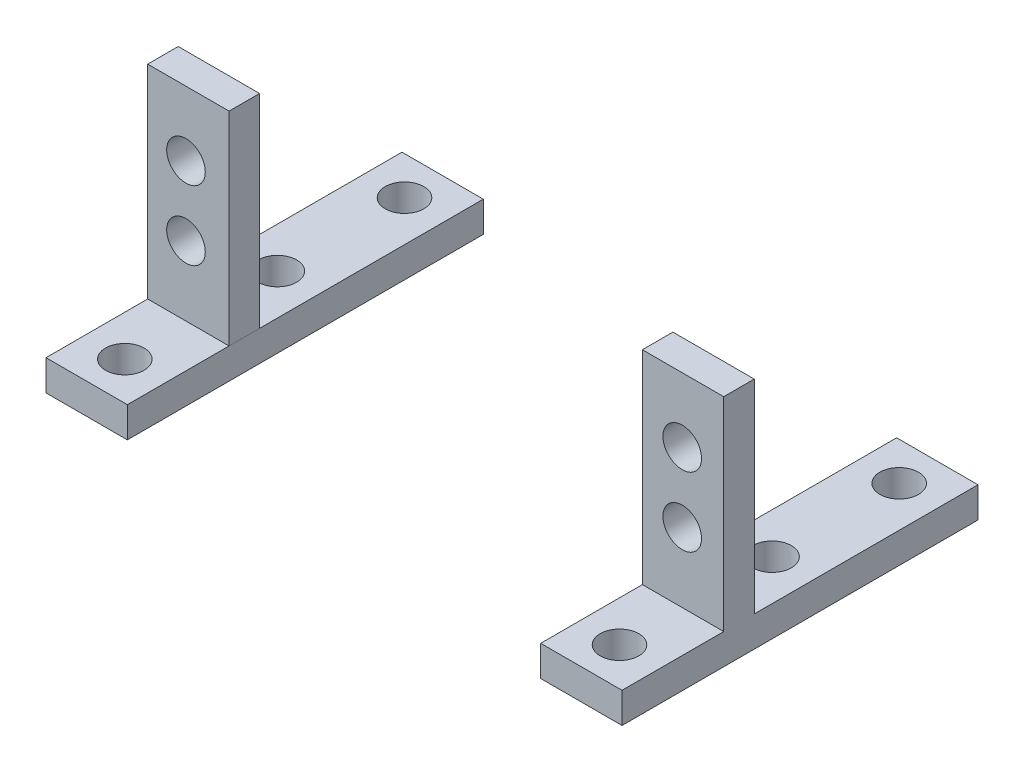
ISO-10303-21;
HEADER;
FILE_DESCRIPTION(('STEP AP214'),'2;1');
FILE_NAME('part.step','',(''),(''),'','','');
FILE_SCHEMA(('AUTOMOTIVE_DESIGN { 1 0 10303 214 1 1 1 1 }'));
ENDSEC;
DATA;
#1=APPLICATION_CONTEXT('core data for automotive mechanical design processes');
#2=APPLICATION_PROTOCOL_DEFINITION('international standard','automotive_design',2000,#1);
#3=PRODUCT_CONTEXT('',#1,'mechanical');
#4=PRODUCT('Part','Part','',(#3));
#5=PRODUCT_RELATED_PRODUCT_CATEGORY('part','',(#4));
#6=PRODUCT_DEFINITION_FORMATION('','',#4);
#7=PRODUCT_DEFINITION_CONTEXT('part definition',#1,'design');
#8=PRODUCT_DEFINITION('design','',#6,#7);
#9=PRODUCT_DEFINITION_SHAPE('','',#8);
#10=(LENGTH_UNIT() NAMED_UNIT(*) SI_UNIT(.MILLI.,.METRE.));
#11=(NAMED_UNIT(*) PLANE_ANGLE_UNIT() SI_UNIT($,.RADIAN.));
#12=(NAMED_UNIT(*) SI_UNIT($,.STERADIAN.) SOLID_ANGLE_UNIT());
#13=UNCERTAINTY_MEASURE_WITH_UNIT(LENGTH_MEASURE(1.E-05),#10,'distance_accuracy_value','');
#14=(GEOMETRIC_REPRESENTATION_CONTEXT(3) GLOBAL_UNCERTAINTY_ASSIGNED_CONTEXT((#13)) GLOBAL_UNIT_ASSIGNED_CONTEXT((#10,
#11,#12)) REPRESENTATION_CONTEXT('',''));
#15=CARTESIAN_POINT('',(0.,0.,0.));
#16=DIRECTION('',(0.,0.,1.));
#17=DIRECTION('',(1.,0.,0.));
#18=AXIS2_PLACEMENT_3D('',#15,#16,#17);
#19=CARTESIAN_POINT('',(-48.64,23.,-10.));
#20=DIRECTION('',(0.,0.,-1.));
#21=DIRECTION('',(-1.,0.,0.));
#22=AXIS2_PLACEMENT_3D('',#19,#20,#21);
#23=PLANE('',#22);
#24=CARTESIAN_POINT('',(-44.8768221418168,9.83031248341872,-10.));
#25=DIRECTION('',(0.,0.,1.));
#26=DIRECTION('',(1.,0.,0.));
#27=AXIS2_PLACEMENT_3D('',#24,#25,#26);
#28=CIRCLE('',#27,1.89865);
#29=CARTESIAN_POINT('',(-42.9781721418168,9.83031248341872,-10.));
#30=VERTEX_POINT('',#29);
#31=EDGE_CURVE('E125',#30,#30,#28,.T.);
#32=ORIENTED_EDGE('',*,*,#31,.F.);
#33=EDGE_LOOP('',(#32));
#34=FACE_BOUND('',#33,.T.);
#35=DIRECTION('',(1.,0.,0.));
#36=VECTOR('',#35,1.);
#37=CARTESIAN_POINT('',(-48.64,3.,-10.));
#38=LINE('',#37,#36);
#39=CARTESIAN_POINT('',(-48.64,3.,-10.));
#40=VERTEX_POINT('',#39);
#41=CARTESIAN_POINT('',(-40.64,3.,-10.));
#42=VERTEX_POINT('',#41);
#43=EDGE_CURVE('E100',#40,#42,#38,.T.);
#44=ORIENTED_EDGE('',*,*,#43,.T.);
#45=DIRECTION('',(0.,-1.,0.));
#46=VECTOR('',#45,1.);
#47=CARTESIAN_POINT('',(-40.64,23.,-10.));
#48=LINE('',#47,#46);
#49=CARTESIAN_POINT('',(-40.64,23.,-10.));
#50=VERTEX_POINT('',#49);
#51=EDGE_CURVE('E53',#50,#42,#48,.T.);
#52=ORIENTED_EDGE('',*,*,#51,.F.);
#53=DIRECTION('',(1.,0.,0.));
#54=VECTOR('',#53,1.);
#55=CARTESIAN_POINT('',(-48.64,23.,-10.));
#56=LINE('',#55,#54);
#57=CARTESIAN_POINT('',(-48.64,23.,-10.));
#58=VERTEX_POINT('',#57);
#59=EDGE_CURVE('E91',#58,#50,#56,.T.);
#60=ORIENTED_EDGE('',*,*,#59,.F.);
#61=DIRECTION('',(0.,-1.,0.));
#62=VECTOR('',#61,1.);
#63=CARTESIAN_POINT('',(-48.64,23.,-10.));
#64=LINE('',#63,#62);
#65=EDGE_CURVE('E12',#58,#40,#64,.T.);
#66=ORIENTED_EDGE('',*,*,#65,.T.);
#67=EDGE_LOOP('',(#44,#52,#60,#66));
#68=FACE_BOUND('',#67,.T.);
#69=CARTESIAN_POINT('',(-44.8768221418168,16.6415737305417,-10.));
#70=DIRECTION('',(0.,0.,1.));
#71=DIRECTION('',(1.,0.,0.));
#72=AXIS2_PLACEMENT_3D('',#69,#70,#71);
#73=CIRCLE('',#72,1.89865);
#74=CARTESIAN_POINT('',(-42.9781721418168,16.6415737305417,-10.));
#75=VERTEX_POINT('',#74);
#76=EDGE_CURVE('E128',#75,#75,#73,.T.);
#77=ORIENTED_EDGE('',*,*,#76,.F.);
#78=EDGE_LOOP('',(#77));
#79=FACE_BOUND('',#78,.T.);
#80=ADVANCED_FACE('F43',(#34,#68,#79),#23,.F.);
#81=CARTESIAN_POINT('',(-48.64,23.,-13.));
#82=DIRECTION('',(1.,0.,0.));
#83=DIRECTION('',(0.,0.,-1.));
#84=AXIS2_PLACEMENT_3D('',#81,#82,#83);
#85=PLANE('',#84);
#86=DIRECTION('',(0.,0.,1.));
#87=VECTOR('',#86,1.);
#88=CARTESIAN_POINT('',(-48.64,3.,-13.));
#89=LINE('',#88,#87);
#90=CARTESIAN_POINT('',(-48.64,3.,-13.));
#91=VERTEX_POINT('',#90);
#92=EDGE_CURVE('E109',#91,#40,#89,.T.);
#93=ORIENTED_EDGE('',*,*,#92,.T.);
#94=ORIENTED_EDGE('',*,*,#65,.F.);
#95=DIRECTION('',(0.,0.,1.));
#96=VECTOR('',#95,1.);
#97=CARTESIAN_POINT('',(-48.64,23.,-13.));
#98=LINE('',#97,#96);
#99=CARTESIAN_POINT('',(-48.64,23.,-13.));
#100=VERTEX_POINT('',#99);
#101=EDGE_CURVE('E96',#100,#58,#98,.T.);
#102=ORIENTED_EDGE('',*,*,#101,.F.);
#103=DIRECTION('',(0.,-1.,0.));
#104=VECTOR('',#103,1.);
#105=CARTESIAN_POINT('',(-48.64,23.,-13.));
#106=LINE('',#105,#104);
#107=EDGE_CURVE('E105',#100,#91,#106,.T.);
#108=ORIENTED_EDGE('',*,*,#107,.T.);
#109=EDGE_LOOP('',(#93,#94,#102,#108));
#110=FACE_BOUND('',#109,.T.);
#111=ADVANCED_FACE('F45',(#110),#85,.F.);
#112=CARTESIAN_POINT('',(-40.64,23.,-13.));
#113=DIRECTION('',(-1.,0.,0.));
#114=DIRECTION('',(0.,0.,1.));
#115=AXIS2_PLACEMENT_3D('',#112,#113,#114);
#116=PLANE('',#115);
#117=DIRECTION('',(0.,0.,-1.));
#118=VECTOR('',#117,1.);
#119=CARTESIAN_POINT('',(-40.64,3.,-13.));
#120=LINE('',#119,#118);
#121=CARTESIAN_POINT('',(-40.64,3.,-13.));
#122=VERTEX_POINT('',#121);
#123=EDGE_CURVE('E78',#42,#122,#120,.T.);
#124=ORIENTED_EDGE('',*,*,#123,.T.);
#125=DIRECTION('',(0.,-1.,0.));
#126=VECTOR('',#125,1.);
#127=CARTESIAN_POINT('',(-40.64,23.,-13.));
#128=LINE('',#127,#126);
#129=CARTESIAN_POINT('',(-40.64,23.,-13.));
#130=VERTEX_POINT('',#129);
#131=EDGE_CURVE('E101',#130,#122,#128,.T.);
#132=ORIENTED_EDGE('',*,*,#131,.F.);
#133=DIRECTION('',(0.,0.,-1.));
#134=VECTOR('',#133,1.);
#135=CARTESIAN_POINT('',(-40.64,23.,-13.));
#136=LINE('',#135,#134);
#137=EDGE_CURVE('E94',#50,#130,#136,.T.);
#138=ORIENTED_EDGE('',*,*,#137,.F.);
#139=ORIENTED_EDGE('',*,*,#51,.T.);
#140=EDGE_LOOP('',(#124,#132,#138,#139));
#141=FACE_BOUND('',#140,.T.);
#142=ADVANCED_FACE('F103',(#141),#116,.F.);
#143=CARTESIAN_POINT('',(-48.64,23.,-13.));
#144=DIRECTION('',(0.,0.,1.));
#145=DIRECTION('',(1.,0.,0.));
#146=AXIS2_PLACEMENT_3D('',#143,#144,#145);
#147=PLANE('',#146);
#148=CARTESIAN_POINT('',(-44.8768221418168,16.6415737305417,-13.));
#149=DIRECTION('',(0.,0.,1.));
#150=DIRECTION('',(1.,0.,0.));
#151=AXIS2_PLACEMENT_3D('',#148,#149,#150);
#152=CIRCLE('',#151,1.89865);
#153=CARTESIAN_POINT('',(-42.9781721418168,16.6415737305417,-13.));
#154=VERTEX_POINT('',#153);
#155=EDGE_CURVE('E47',#154,#154,#152,.T.);
#156=ORIENTED_EDGE('',*,*,#155,.T.);
#157=EDGE_LOOP('',(#156));
#158=FACE_BOUND('',#157,.T.);
#159=CARTESIAN_POINT('',(-44.8768221418168,9.83031248341872,-13.));
#160=DIRECTION('',(0.,0.,1.));
#161=DIRECTION('',(1.,0.,0.));
#162=AXIS2_PLACEMENT_3D('',#159,#160,#161);
#163=CIRCLE('',#162,1.89865);
#164=CARTESIAN_POINT('',(-42.9781721418168,9.83031248341872,-13.));
#165=VERTEX_POINT('',#164);
#166=EDGE_CURVE('E112',#165,#165,#163,.T.);
#167=ORIENTED_EDGE('',*,*,#166,.T.);
#168=EDGE_LOOP('',(#167));
#169=FACE_BOUND('',#168,.T.);
#170=DIRECTION('',(-1.,0.,0.));
#171=VECTOR('',#170,1.);
#172=CARTESIAN_POINT('',(-48.64,3.,-13.));
#173=LINE('',#172,#171);
#174=EDGE_CURVE('E84',#122,#91,#173,.T.);
#175=ORIENTED_EDGE('',*,*,#174,.T.);
#176=ORIENTED_EDGE('',*,*,#107,.F.);
#177=DIRECTION('',(-1.,0.,0.));
#178=VECTOR('',#177,1.);
#179=CARTESIAN_POINT('',(-48.64,23.,-13.));
#180=LINE('',#179,#178);
#181=EDGE_CURVE('E61',#130,#100,#180,.T.);
#182=ORIENTED_EDGE('',*,*,#181,.F.);
#183=ORIENTED_EDGE('',*,*,#131,.T.);
#184=EDGE_LOOP('',(#175,#176,#182,#183));
#185=FACE_BOUND('',#184,.T.);
#186=ADVANCED_FACE('F117',(#158,#169,#185),#147,.F.);
#187=CARTESIAN_POINT('',(0.,23.,0.));
#188=DIRECTION('',(0.,1.,0.));
#189=DIRECTION('',(0.,0.,1.));
#190=AXIS2_PLACEMENT_3D('',#187,#188,#189);
#191=PLANE('',#190);
#192=ORIENTED_EDGE('',*,*,#101,.T.);
#193=ORIENTED_EDGE('',*,*,#59,.T.);
#194=ORIENTED_EDGE('',*,*,#137,.T.);
#195=ORIENTED_EDGE('',*,*,#181,.T.);
#196=EDGE_LOOP('',(#192,#193,#194,#195));
#197=FACE_BOUND('',#196,.T.);
#198=ADVANCED_FACE('F92',(#197),#191,.T.);
#199=CARTESIAN_POINT('',(0.,3.,0.));
#200=DIRECTION('',(0.,1.,0.));
#201=DIRECTION('',(0.,0.,1.));
#202=AXIS2_PLACEMENT_3D('',#199,#200,#201);
#203=PLANE('',#202);
#204=ORIENTED_EDGE('',*,*,#92,.F.);
#205=ORIENTED_EDGE('',*,*,#174,.F.);
#206=ORIENTED_EDGE('',*,*,#123,.F.);
#207=ORIENTED_EDGE('',*,*,#43,.F.);
#208=EDGE_LOOP('',(#204,#205,#206,#207));
#209=FACE_BOUND('',#208,.T.);
#210=ADVANCED_FACE('F120',(#209),#203,.F.);
#211=CARTESIAN_POINT('',(-44.8768221418168,9.83031248341872,-10.));
#212=DIRECTION('',(0.,0.,1.));
#213=DIRECTION('',(1.,0.,0.));
#214=AXIS2_PLACEMENT_3D('',#211,#212,#213);
#215=CYLINDRICAL_SURFACE('',#214,1.89865);
#216=ORIENTED_EDGE('',*,*,#31,.T.);
#217=EDGE_LOOP('',(#216));
#218=FACE_BOUND('',#217,.T.);
#219=ORIENTED_EDGE('',*,*,#166,.F.);
#220=EDGE_LOOP('',(#219));
#221=FACE_BOUND('',#220,.T.);
#222=ADVANCED_FACE('F139',(#218,#221),#215,.F.);
#223=CARTESIAN_POINT('',(-44.8768221418168,16.6415737305417,-10.));
#224=DIRECTION('',(0.,0.,1.));
#225=DIRECTION('',(1.,0.,0.));
#226=AXIS2_PLACEMENT_3D('',#223,#224,#225);
#227=CYLINDRICAL_SURFACE('',#226,1.89865);
#228=ORIENTED_EDGE('',*,*,#76,.T.);
#229=EDGE_LOOP('',(#228));
#230=FACE_BOUND('',#229,.T.);
#231=ORIENTED_EDGE('',*,*,#155,.F.);
#232=EDGE_LOOP('',(#231));
#233=FACE_BOUND('',#232,.T.);
#234=ADVANCED_FACE('F137',(#230,#233),#227,.F.);
#235=CLOSED_SHELL('',(#80,#111,#142,#186,#198,#210,#222,#234));
#236=MANIFOLD_SOLID_BREP('B2',#235);
#237=CARTESIAN_POINT('',(-48.64,3.,-35.));
#238=DIRECTION('',(1.,0.,0.));
#239=DIRECTION('',(0.,0.,-1.));
#240=AXIS2_PLACEMENT_3D('',#237,#238,#239);
#241=PLANE('',#240);
#242=DIRECTION('',(0.,0.,1.));
#243=VECTOR('',#242,1.);
#244=CARTESIAN_POINT('',(-48.64,0.,-35.));
#245=LINE('',#244,#243);
#246=CARTESIAN_POINT('',(-48.64,0.,-35.));
#247=VERTEX_POINT('',#246);
#248=CARTESIAN_POINT('',(-48.64,0.,0.));
#249=VERTEX_POINT('',#248);
#250=EDGE_CURVE('E281',#247,#249,#245,.T.);
#251=ORIENTED_EDGE('',*,*,#250,.T.);
#252=DIRECTION('',(0.,-1.,0.));
#253=VECTOR('',#252,1.);
#254=CARTESIAN_POINT('',(-48.64,3.,0.));
#255=LINE('',#254,#253);
#256=CARTESIAN_POINT('',(-48.64,3.,0.));
#257=VERTEX_POINT('',#256);
#258=EDGE_CURVE('E41',#257,#249,#255,.T.);
#259=ORIENTED_EDGE('',*,*,#258,.F.);
#260=DIRECTION('',(0.,0.,1.));
#261=VECTOR('',#260,1.);
#262=CARTESIAN_POINT('',(-48.64,3.,-35.));
#263=LINE('',#262,#261);
#264=CARTESIAN_POINT('',(-48.64,3.,-35.));
#265=VERTEX_POINT('',#264);
#266=EDGE_CURVE('E269',#265,#257,#263,.T.);
#267=ORIENTED_EDGE('',*,*,#266,.F.);
#268=DIRECTION('',(0.,-1.,0.));
#269=VECTOR('',#268,1.);
#270=CARTESIAN_POINT('',(-48.64,3.,-35.));
#271=LINE('',#270,#269);
#272=EDGE_CURVE('E277',#265,#247,#271,.T.);
#273=ORIENTED_EDGE('',*,*,#272,.T.);
#274=EDGE_LOOP('',(#251,#259,#267,#273));
#275=FACE_BOUND('',#274,.T.);
#276=ADVANCED_FACE('F218',(#275),#241,.F.);
#277=CARTESIAN_POINT('',(-48.64,3.,0.));
#278=DIRECTION('',(0.,0.,-1.));
#279=DIRECTION('',(-1.,0.,0.));
#280=AXIS2_PLACEMENT_3D('',#277,#278,#279);
#281=PLANE('',#280);
#282=DIRECTION('',(1.,0.,0.));
#283=VECTOR('',#282,1.);
#284=CARTESIAN_POINT('',(-48.64,0.,0.));
#285=LINE('',#284,#283);
#286=CARTESIAN_POINT('',(-40.64,0.,0.));
#287=VERTEX_POINT('',#286);
#288=EDGE_CURVE('E273',#249,#287,#285,.T.);
#289=ORIENTED_EDGE('',*,*,#288,.T.);
#290=DIRECTION('',(0.,-1.,0.));
#291=VECTOR('',#290,1.);
#292=CARTESIAN_POINT('',(-40.64,3.,0.));
#293=LINE('',#292,#291);
#294=CARTESIAN_POINT('',(-40.64,3.,0.));
#295=VERTEX_POINT('',#294);
#296=EDGE_CURVE('E226',#295,#287,#293,.T.);
#297=ORIENTED_EDGE('',*,*,#296,.F.);
#298=DIRECTION('',(1.,0.,0.));
#299=VECTOR('',#298,1.);
#300=CARTESIAN_POINT('',(-48.64,3.,0.));
#301=LINE('',#300,#299);
#302=EDGE_CURVE('E264',#257,#295,#301,.T.);
#303=ORIENTED_EDGE('',*,*,#302,.F.);
#304=ORIENTED_EDGE('',*,*,#258,.T.);
#305=EDGE_LOOP('',(#289,#297,#303,#304));
#306=FACE_BOUND('',#305,.T.);
#307=ADVANCED_FACE('F272',(#306),#281,.F.);
#308=CARTESIAN_POINT('',(-40.64,3.,-35.));
#309=DIRECTION('',(-1.,0.,0.));
#310=DIRECTION('',(0.,0.,1.));
#311=AXIS2_PLACEMENT_3D('',#308,#309,#310);
#312=PLANE('',#311);
#313=DIRECTION('',(0.,0.,-1.));
#314=VECTOR('',#313,1.);
#315=CARTESIAN_POINT('',(-40.64,0.,-35.));
#316=LINE('',#315,#314);
#317=CARTESIAN_POINT('',(-40.64,0.,-35.));
#318=VERTEX_POINT('',#317);
#319=EDGE_CURVE('E251',#287,#318,#316,.T.);
#320=ORIENTED_EDGE('',*,*,#319,.T.);
#321=DIRECTION('',(0.,-1.,0.));
#322=VECTOR('',#321,1.);
#323=CARTESIAN_POINT('',(-40.64,3.,-35.));
#324=LINE('',#323,#322);
#325=CARTESIAN_POINT('',(-40.64,3.,-35.));
#326=VERTEX_POINT('',#325);
#327=EDGE_CURVE('E274',#326,#318,#324,.T.);
#328=ORIENTED_EDGE('',*,*,#327,.F.);
#329=DIRECTION('',(0.,0.,-1.));
#330=VECTOR('',#329,1.);
#331=CARTESIAN_POINT('',(-40.64,3.,-35.));
#332=LINE('',#331,#330);
#333=EDGE_CURVE('E267',#295,#326,#332,.T.);
#334=ORIENTED_EDGE('',*,*,#333,.F.);
#335=ORIENTED_EDGE('',*,*,#296,.T.);
#336=EDGE_LOOP('',(#320,#328,#334,#335));
#337=FACE_BOUND('',#336,.T.);
#338=ADVANCED_FACE('F275',(#337),#312,.F.);
#339=CARTESIAN_POINT('',(-48.64,3.,-35.));
#340=DIRECTION('',(0.,0.,1.));
#341=DIRECTION('',(1.,0.,0.));
#342=AXIS2_PLACEMENT_3D('',#339,#340,#341);
#343=PLANE('',#342);
#344=DIRECTION('',(-1.,0.,0.));
#345=VECTOR('',#344,1.);
#346=CARTESIAN_POINT('',(-48.64,0.,-35.));
#347=LINE('',#346,#345);
#348=EDGE_CURVE('E257',#318,#247,#347,.T.);
#349=ORIENTED_EDGE('',*,*,#348,.T.);
#350=ORIENTED_EDGE('',*,*,#272,.F.);
#351=DIRECTION('',(-1.,0.,0.));
#352=VECTOR('',#351,1.);
#353=CARTESIAN_POINT('',(-48.64,3.,-35.));
#354=LINE('',#353,#352);
#355=EDGE_CURVE('E234',#326,#265,#354,.T.);
#356=ORIENTED_EDGE('',*,*,#355,.F.);
#357=ORIENTED_EDGE('',*,*,#327,.T.);
#358=EDGE_LOOP('',(#349,#350,#356,#357));
#359=FACE_BOUND('',#358,.T.);
#360=ADVANCED_FACE('F289',(#359),#343,.F.);
#361=CARTESIAN_POINT('',(0.,3.,0.));
#362=DIRECTION('',(0.,1.,0.));
#363=DIRECTION('',(0.,0.,1.));
#364=AXIS2_PLACEMENT_3D('',#361,#362,#363);
#365=PLANE('',#364);
#366=CARTESIAN_POINT('',(-44.64,3.,-31.25));
#367=DIRECTION('',(0.,1.,0.));
#368=DIRECTION('',(0.,0.,1.));
#369=AXIS2_PLACEMENT_3D('',#366,#367,#368);
#370=CIRCLE('',#369,1.89864999999999);
#371=CARTESIAN_POINT('',(-44.64,3.,-29.35135));
#372=VERTEX_POINT('',#371);
#373=EDGE_CURVE('E309',#372,#372,#370,.T.);
#374=ORIENTED_EDGE('',*,*,#373,.F.);
#375=EDGE_LOOP('',(#374));
#376=FACE_BOUND('',#375,.T.);
#377=CARTESIAN_POINT('',(-44.64,3.,-18.75));
#378=DIRECTION('',(0.,1.,0.));
#379=DIRECTION('',(0.,0.,1.));
#380=AXIS2_PLACEMENT_3D('',#377,#378,#379);
#381=CIRCLE('',#380,1.89864999999999);
#382=CARTESIAN_POINT('',(-44.64,3.,-16.85135));
#383=VERTEX_POINT('',#382);
#384=EDGE_CURVE('E303',#383,#383,#381,.T.);
#385=ORIENTED_EDGE('',*,*,#384,.F.);
#386=EDGE_LOOP('',(#385));
#387=FACE_BOUND('',#386,.T.);
#388=CARTESIAN_POINT('',(-44.64,3.,-3.75));
#389=DIRECTION('',(0.,1.,0.));
#390=DIRECTION('',(0.,0.,1.));
#391=AXIS2_PLACEMENT_3D('',#388,#389,#390);
#392=CIRCLE('',#391,1.89864999999999);
#393=CARTESIAN_POINT('',(-44.64,3.,-1.85135000000001));
#394=VERTEX_POINT('',#393);
#395=EDGE_CURVE('E297',#394,#394,#392,.T.);
#396=ORIENTED_EDGE('',*,*,#395,.F.);
#397=EDGE_LOOP('',(#396));
#398=FACE_BOUND('',#397,.T.);
#399=ORIENTED_EDGE('',*,*,#266,.T.);
#400=ORIENTED_EDGE('',*,*,#302,.T.);
#401=ORIENTED_EDGE('',*,*,#333,.T.);
#402=ORIENTED_EDGE('',*,*,#355,.T.);
#403=EDGE_LOOP('',(#399,#400,#401,#402));
#404=FACE_BOUND('',#403,.T.);
#405=ADVANCED_FACE('F265',(#376,#387,#398,#404),#365,.T.);
#406=CARTESIAN_POINT('',(0.,0.,0.));
#407=DIRECTION('',(0.,1.,0.));
#408=DIRECTION('',(0.,0.,1.));
#409=AXIS2_PLACEMENT_3D('',#406,#407,#408);
#410=PLANE('',#409);
#411=CARTESIAN_POINT('',(-44.64,0.,-31.25));
#412=DIRECTION('',(0.,1.,0.));
#413=DIRECTION('',(0.,0.,1.));
#414=AXIS2_PLACEMENT_3D('',#411,#412,#413);
#415=CIRCLE('',#414,1.89865);
#416=CARTESIAN_POINT('',(-44.64,0.,-29.35135));
#417=VERTEX_POINT('',#416);
#418=EDGE_CURVE('E306',#417,#417,#415,.T.);
#419=ORIENTED_EDGE('',*,*,#418,.T.);
#420=EDGE_LOOP('',(#419));
#421=FACE_BOUND('',#420,.T.);
#422=CARTESIAN_POINT('',(-44.64,0.,-18.75));
#423=DIRECTION('',(0.,1.,0.));
#424=DIRECTION('',(0.,0.,1.));
#425=AXIS2_PLACEMENT_3D('',#422,#423,#424);
#426=CIRCLE('',#425,1.89865);
#427=CARTESIAN_POINT('',(-44.64,0.,-16.85135));
#428=VERTEX_POINT('',#427);
#429=EDGE_CURVE('E300',#428,#428,#426,.T.);
#430=ORIENTED_EDGE('',*,*,#429,.T.);
#431=EDGE_LOOP('',(#430));
#432=FACE_BOUND('',#431,.T.);
#433=CARTESIAN_POINT('',(-44.64,0.,-3.75));
#434=DIRECTION('',(0.,1.,0.));
#435=DIRECTION('',(0.,0.,1.));
#436=AXIS2_PLACEMENT_3D('',#433,#434,#435);
#437=CIRCLE('',#436,1.89865);
#438=CARTESIAN_POINT('',(-44.64,0.,-1.85135));
#439=VERTEX_POINT('',#438);
#440=EDGE_CURVE('E284',#439,#439,#437,.T.);
#441=ORIENTED_EDGE('',*,*,#440,.T.);
#442=EDGE_LOOP('',(#441));
#443=FACE_BOUND('',#442,.T.);
#444=ORIENTED_EDGE('',*,*,#250,.F.);
#445=ORIENTED_EDGE('',*,*,#348,.F.);
#446=ORIENTED_EDGE('',*,*,#319,.F.);
#447=ORIENTED_EDGE('',*,*,#288,.F.);
#448=EDGE_LOOP('',(#444,#445,#446,#447));
#449=FACE_BOUND('',#448,.T.);
#450=ADVANCED_FACE('F292',(#421,#432,#443,#449),#410,.F.);
#451=CARTESIAN_POINT('',(-44.64,3.,-3.75));
#452=DIRECTION('',(0.,1.,0.));
#453=DIRECTION('',(0.,0.,1.));
#454=AXIS2_PLACEMENT_3D('',#451,#452,#453);
#455=CYLINDRICAL_SURFACE('',#454,1.89864999999999);
#456=ORIENTED_EDGE('',*,*,#440,.F.);
#457=EDGE_LOOP('',(#456));
#458=FACE_BOUND('',#457,.T.);
#459=ORIENTED_EDGE('',*,*,#395,.T.);
#460=EDGE_LOOP('',(#459));
#461=FACE_BOUND('',#460,.T.);
#462=ADVANCED_FACE('F322',(#458,#461),#455,.F.);
#463=CARTESIAN_POINT('',(-44.64,3.,-18.75));
#464=DIRECTION('',(0.,1.,0.));
#465=DIRECTION('',(0.,0.,1.));
#466=AXIS2_PLACEMENT_3D('',#463,#464,#465);
#467=CYLINDRICAL_SURFACE('',#466,1.89864999999999);
#468=ORIENTED_EDGE('',*,*,#429,.F.);
#469=EDGE_LOOP('',(#468));
#470=FACE_BOUND('',#469,.T.);
#471=ORIENTED_EDGE('',*,*,#384,.T.);
#472=EDGE_LOOP('',(#471));
#473=FACE_BOUND('',#472,.T.);
#474=ADVANCED_FACE('F324',(#470,#473),#467,.F.);
#475=CARTESIAN_POINT('',(-44.64,3.,-31.25));
#476=DIRECTION('',(0.,1.,0.));
#477=DIRECTION('',(0.,0.,1.));
#478=AXIS2_PLACEMENT_3D('',#475,#476,#477);
#479=CYLINDRICAL_SURFACE('',#478,1.89864999999999);
#480=ORIENTED_EDGE('',*,*,#418,.F.);
#481=EDGE_LOOP('',(#480));
#482=FACE_BOUND('',#481,.T.);
#483=ORIENTED_EDGE('',*,*,#373,.T.);
#484=EDGE_LOOP('',(#483));
#485=FACE_BOUND('',#484,.T.);
#486=ADVANCED_FACE('F313',(#482,#485),#479,.F.);
#487=CLOSED_SHELL('',(#276,#307,#338,#360,#405,#450,#462,#474,#486));
#488=MANIFOLD_SOLID_BREP('B6',#487);
#489=CARTESIAN_POINT('',(0.,3.,0.));
#490=DIRECTION('',(0.,1.,0.));
#491=DIRECTION('',(0.,0.,1.));
#492=AXIS2_PLACEMENT_3D('',#489,#490,#491);
#493=PLANE('',#492);
#494=CARTESIAN_POINT('',(4.,3.,-31.25));
#495=DIRECTION('',(0.,1.,0.));
#496=DIRECTION('',(0.,0.,1.));
#497=AXIS2_PLACEMENT_3D('',#494,#495,#496);
#498=CIRCLE('',#497,1.89864999999999);
#499=CARTESIAN_POINT('',(4.,3.,-29.35135));
#500=VERTEX_POINT('',#499);
#501=EDGE_CURVE('E576',#500,#500,#498,.T.);
#502=ORIENTED_EDGE('',*,*,#501,.F.);
#503=EDGE_LOOP('',(#502));
#504=FACE_BOUND('',#503,.T.);
#505=CARTESIAN_POINT('',(4.,3.,-18.75));
#506=DIRECTION('',(0.,1.,0.));
#507=DIRECTION('',(0.,0.,1.));
#508=AXIS2_PLACEMENT_3D('',#505,#506,#507);
#509=CIRCLE('',#508,1.89864999999999);
#510=CARTESIAN_POINT('',(4.,3.,-16.85135));
#511=VERTEX_POINT('',#510);
#512=EDGE_CURVE('E570',#511,#511,#509,.T.);
#513=ORIENTED_EDGE('',*,*,#512,.F.);
#514=EDGE_LOOP('',(#513));
#515=FACE_BOUND('',#514,.T.);
#516=DIRECTION('',(-1.,0.,0.));
#517=VECTOR('',#516,1.);
#518=CARTESIAN_POINT('',(0.,3.,-13.));
#519=LINE('',#518,#517);
#520=CARTESIAN_POINT('',(7.99999999999999,3.,-13.));
#521=VERTEX_POINT('',#520);
#522=CARTESIAN_POINT('',(0.,3.,-13.));
#523=VERTEX_POINT('',#522);
#524=EDGE_CURVE('E420',#521,#523,#519,.T.);
#525=ORIENTED_EDGE('',*,*,#524,.F.);
#526=DIRECTION('',(0.,0.,-1.));
#527=VECTOR('',#526,1.);
#528=CARTESIAN_POINT('',(7.99999999999999,3.,-35.));
#529=LINE('',#528,#527);
#530=CARTESIAN_POINT('',(7.99999999999999,3.,-35.));
#531=VERTEX_POINT('',#530);
#532=EDGE_CURVE('E505',#521,#531,#529,.T.);
#533=ORIENTED_EDGE('',*,*,#532,.T.);
#534=DIRECTION('',(-1.,0.,0.));
#535=VECTOR('',#534,1.);
#536=CARTESIAN_POINT('',(0.,3.,-35.));
#537=LINE('',#536,#535);
#538=CARTESIAN_POINT('',(0.,3.,-35.));
#539=VERTEX_POINT('',#538);
#540=EDGE_CURVE('E508',#531,#539,#537,.T.);
#541=ORIENTED_EDGE('',*,*,#540,.T.);
#542=DIRECTION('',(0.,0.,1.));
#543=VECTOR('',#542,1.);
#544=CARTESIAN_POINT('',(0.,3.,-35.));
#545=LINE('',#544,#543);
#546=EDGE_CURVE('E501',#539,#523,#545,.T.);
#547=ORIENTED_EDGE('',*,*,#546,.T.);
#548=EDGE_LOOP('',(#525,#533,#541,#547));
#549=FACE_BOUND('',#548,.T.);
#550=ADVANCED_FACE('F405',(#504,#515,#549),#493,.T.);
#551=CARTESIAN_POINT('',(0.,3.,-35.));
#552=DIRECTION('',(1.,0.,0.));
#553=DIRECTION('',(0.,0.,-1.));
#554=AXIS2_PLACEMENT_3D('',#551,#552,#553);
#555=PLANE('',#554);
#556=DIRECTION('',(0.,0.,1.));
#557=VECTOR('',#556,1.);
#558=CARTESIAN_POINT('',(0.,0.,-35.));
#559=LINE('',#558,#557);
#560=CARTESIAN_POINT('',(0.,0.,-35.));
#561=VERTEX_POINT('',#560);
#562=CARTESIAN_POINT('',(0.,0.,0.));
#563=VERTEX_POINT('',#562);
#564=EDGE_CURVE('E493',#561,#563,#559,.T.);
#565=ORIENTED_EDGE('',*,*,#564,.T.);
#566=DIRECTION('',(0.,-1.,0.));
#567=VECTOR('',#566,1.);
#568=CARTESIAN_POINT('',(0.,3.,0.));
#569=LINE('',#568,#567);
#570=CARTESIAN_POINT('',(0.,3.,0.));
#571=VERTEX_POINT('',#570);
#572=EDGE_CURVE('E216',#571,#563,#569,.T.);
#573=ORIENTED_EDGE('',*,*,#572,.F.);
#574=CARTESIAN_POINT('',(0.,3.,-10.));
#575=VERTEX_POINT('',#574);
#576=EDGE_CURVE('E492',#575,#571,#545,.T.);
#577=ORIENTED_EDGE('',*,*,#576,.F.);
#578=DIRECTION('',(0.,-1.,0.));
#579=VECTOR('',#578,1.);
#580=CARTESIAN_POINT('',(0.,23.,-10.));
#581=LINE('',#580,#579);
#582=CARTESIAN_POINT('',(0.,23.,-10.));
#583=VERTEX_POINT('',#582);
#584=EDGE_CURVE('E474',#583,#575,#581,.T.);
#585=ORIENTED_EDGE('',*,*,#584,.F.);
#586=DIRECTION('',(0.,0.,1.));
#587=VECTOR('',#586,1.);
#588=CARTESIAN_POINT('',(0.,23.,-13.));
#589=LINE('',#588,#587);
#590=CARTESIAN_POINT('',(0.,23.,-13.));
#591=VERTEX_POINT('',#590);
#592=EDGE_CURVE('E480',#591,#583,#589,.T.);
#593=ORIENTED_EDGE('',*,*,#592,.F.);
#594=DIRECTION('',(0.,-1.,0.));
#595=VECTOR('',#594,1.);
#596=CARTESIAN_POINT('',(0.,23.,-13.));
#597=LINE('',#596,#595);
#598=EDGE_CURVE('E538',#591,#523,#597,.T.);
#599=ORIENTED_EDGE('',*,*,#598,.T.);
#600=ORIENTED_EDGE('',*,*,#546,.F.);
#601=DIRECTION('',(0.,-1.,0.));
#602=VECTOR('',#601,1.);
#603=CARTESIAN_POINT('',(0.,3.,-35.));
#604=LINE('',#603,#602);
#605=EDGE_CURVE('E509',#539,#561,#604,.T.);
#606=ORIENTED_EDGE('',*,*,#605,.T.);
#607=EDGE_LOOP('',(#565,#573,#577,#585,#593,#599,#600,#606));
#608=FACE_BOUND('',#607,.T.);
#609=ADVANCED_FACE('F407',(#608),#555,.F.);
#610=CARTESIAN_POINT('',(0.,3.,0.));
#611=DIRECTION('',(0.,0.,-1.));
#612=DIRECTION('',(-1.,0.,0.));
#613=AXIS2_PLACEMENT_3D('',#610,#611,#612);
#614=PLANE('',#613);
#615=DIRECTION('',(1.,0.,0.));
#616=VECTOR('',#615,1.);
#617=CARTESIAN_POINT('',(0.,0.,0.));
#618=LINE('',#617,#616);
#619=CARTESIAN_POINT('',(8.,0.,0.));
#620=VERTEX_POINT('',#619);
#621=EDGE_CURVE('E495',#563,#620,#618,.T.);
#622=ORIENTED_EDGE('',*,*,#621,.T.);
#623=DIRECTION('',(0.,-1.,0.));
#624=VECTOR('',#623,1.);
#625=CARTESIAN_POINT('',(8.,3.,0.));
#626=LINE('',#625,#624);
#627=CARTESIAN_POINT('',(8.,3.,0.));
#628=VERTEX_POINT('',#627);
#629=EDGE_CURVE('E413',#628,#620,#626,.T.);
#630=ORIENTED_EDGE('',*,*,#629,.F.);
#631=DIRECTION('',(1.,0.,0.));
#632=VECTOR('',#631,1.);
#633=CARTESIAN_POINT('',(0.,3.,0.));
#634=LINE('',#633,#632);
#635=EDGE_CURVE('E503',#571,#628,#634,.T.);
#636=ORIENTED_EDGE('',*,*,#635,.F.);
#637=ORIENTED_EDGE('',*,*,#572,.T.);
#638=EDGE_LOOP('',(#622,#630,#636,#637));
#639=FACE_BOUND('',#638,.T.);
#640=ADVANCED_FACE('F627',(#639),#614,.F.);
#641=CARTESIAN_POINT('',(7.99999999999999,3.,-35.));
#642=DIRECTION('',(-1.,0.,0.));
#643=DIRECTION('',(0.,0.,1.));
#644=AXIS2_PLACEMENT_3D('',#641,#642,#643);
#645=PLANE('',#644);
#646=DIRECTION('',(0.,0.,-1.));
#647=VECTOR('',#646,1.);
#648=CARTESIAN_POINT('',(7.99999999999999,0.,-35.));
#649=LINE('',#648,#647);
#650=CARTESIAN_POINT('',(7.99999999999999,0.,-35.));
#651=VERTEX_POINT('',#650);
#652=EDGE_CURVE('E512',#620,#651,#649,.T.);
#653=ORIENTED_EDGE('',*,*,#652,.T.);
#654=DIRECTION('',(0.,-1.,0.));
#655=VECTOR('',#654,1.);
#656=CARTESIAN_POINT('',(7.99999999999999,3.,-35.));
#657=LINE('',#656,#655);
#658=EDGE_CURVE('E518',#531,#651,#657,.T.);
#659=ORIENTED_EDGE('',*,*,#658,.F.);
#660=ORIENTED_EDGE('',*,*,#532,.F.);
#661=DIRECTION('',(0.,-1.,0.));
#662=VECTOR('',#661,1.);
#663=CARTESIAN_POINT('',(8.,23.,-13.));
#664=LINE('',#663,#662);
#665=CARTESIAN_POINT('',(8.,23.,-13.));
#666=VERTEX_POINT('',#665);
#667=EDGE_CURVE('E497',#666,#521,#664,.T.);
#668=ORIENTED_EDGE('',*,*,#667,.F.);
#669=DIRECTION('',(0.,0.,-1.));
#670=VECTOR('',#669,1.);
#671=CARTESIAN_POINT('',(8.,23.,-13.));
#672=LINE('',#671,#670);
#673=CARTESIAN_POINT('',(8.,23.,-10.));
#674=VERTEX_POINT('',#673);
#675=EDGE_CURVE('E479',#674,#666,#672,.T.);
#676=ORIENTED_EDGE('',*,*,#675,.F.);
#677=DIRECTION('',(0.,-1.,0.));
#678=VECTOR('',#677,1.);
#679=CARTESIAN_POINT('',(8.,23.,-10.));
#680=LINE('',#679,#678);
#681=CARTESIAN_POINT('',(8.,3.,-10.));
#682=VERTEX_POINT('',#681);
#683=EDGE_CURVE('E476',#674,#682,#680,.T.);
#684=ORIENTED_EDGE('',*,*,#683,.T.);
#685=EDGE_CURVE('E506',#628,#682,#529,.T.);
#686=ORIENTED_EDGE('',*,*,#685,.F.);
#687=ORIENTED_EDGE('',*,*,#629,.T.);
#688=EDGE_LOOP('',(#653,#659,#660,#668,#676,#684,#686,#687));
#689=FACE_BOUND('',#688,.T.);
#690=ADVANCED_FACE('F525',(#689),#645,.F.);
#691=CARTESIAN_POINT('',(0.,3.,-35.));
#692=DIRECTION('',(0.,0.,1.));
#693=DIRECTION('',(1.,0.,0.));
#694=AXIS2_PLACEMENT_3D('',#691,#692,#693);
#695=PLANE('',#694);
#696=DIRECTION('',(-1.,0.,0.));
#697=VECTOR('',#696,1.);
#698=CARTESIAN_POINT('',(0.,0.,-35.));
#699=LINE('',#698,#697);
#700=EDGE_CURVE('E514',#651,#561,#699,.T.);
#701=ORIENTED_EDGE('',*,*,#700,.T.);
#702=ORIENTED_EDGE('',*,*,#605,.F.);
#703=ORIENTED_EDGE('',*,*,#540,.F.);
#704=ORIENTED_EDGE('',*,*,#658,.T.);
#705=EDGE_LOOP('',(#701,#702,#703,#704));
#706=FACE_BOUND('',#705,.T.);
#707=ADVANCED_FACE('F535',(#706),#695,.F.);
#708=CARTESIAN_POINT('',(4.,3.,-3.75));
#709=DIRECTION('',(0.,1.,0.));
#710=DIRECTION('',(0.,0.,1.));
#711=AXIS2_PLACEMENT_3D('',#708,#709,#710);
#712=CIRCLE('',#711,1.89864999999999);
#713=CARTESIAN_POINT('',(4.,3.,-1.85135000000001));
#714=VERTEX_POINT('',#713);
#715=EDGE_CURVE('E564',#714,#714,#712,.T.);
#716=ORIENTED_EDGE('',*,*,#715,.F.);
#717=EDGE_LOOP('',(#716));
#718=FACE_BOUND('',#717,.T.);
#719=DIRECTION('',(1.,0.,0.));
#720=VECTOR('',#719,1.);
#721=CARTESIAN_POINT('',(0.,3.,-10.));
#722=LINE('',#721,#720);
#723=EDGE_CURVE('E428',#575,#682,#722,.T.);
#724=ORIENTED_EDGE('',*,*,#723,.F.);
#725=ORIENTED_EDGE('',*,*,#576,.T.);
#726=ORIENTED_EDGE('',*,*,#635,.T.);
#727=ORIENTED_EDGE('',*,*,#685,.T.);
#728=EDGE_LOOP('',(#724,#725,#726,#727));
#729=FACE_BOUND('',#728,.T.);
#730=ADVANCED_FACE('F585',(#718,#729),#493,.T.);
#731=CARTESIAN_POINT('',(0.,0.,0.));
#732=DIRECTION('',(0.,1.,0.));
#733=DIRECTION('',(0.,0.,1.));
#734=AXIS2_PLACEMENT_3D('',#731,#732,#733);
#735=PLANE('',#734);
#736=CARTESIAN_POINT('',(4.,0.,-31.25));
#737=DIRECTION('',(0.,1.,0.));
#738=DIRECTION('',(0.,0.,1.));
#739=AXIS2_PLACEMENT_3D('',#736,#737,#738);
#740=CIRCLE('',#739,1.89865);
#741=CARTESIAN_POINT('',(4.,0.,-29.35135));
#742=VERTEX_POINT('',#741);
#743=EDGE_CURVE('E573',#742,#742,#740,.T.);
#744=ORIENTED_EDGE('',*,*,#743,.T.);
#745=EDGE_LOOP('',(#744));
#746=FACE_BOUND('',#745,.T.);
#747=CARTESIAN_POINT('',(4.,0.,-18.75));
#748=DIRECTION('',(0.,1.,0.));
#749=DIRECTION('',(0.,0.,1.));
#750=AXIS2_PLACEMENT_3D('',#747,#748,#749);
#751=CIRCLE('',#750,1.89865);
#752=CARTESIAN_POINT('',(4.,0.,-16.85135));
#753=VERTEX_POINT('',#752);
#754=EDGE_CURVE('E567',#753,#753,#751,.T.);
#755=ORIENTED_EDGE('',*,*,#754,.T.);
#756=EDGE_LOOP('',(#755));
#757=FACE_BOUND('',#756,.T.);
#758=CARTESIAN_POINT('',(4.,0.,-3.75));
#759=DIRECTION('',(0.,1.,0.));
#760=DIRECTION('',(0.,0.,1.));
#761=AXIS2_PLACEMENT_3D('',#758,#759,#760);
#762=CIRCLE('',#761,1.89865);
#763=CARTESIAN_POINT('',(4.,0.,-1.85135));
#764=VERTEX_POINT('',#763);
#765=EDGE_CURVE('E561',#764,#764,#762,.T.);
#766=ORIENTED_EDGE('',*,*,#765,.T.);
#767=EDGE_LOOP('',(#766));
#768=FACE_BOUND('',#767,.T.);
#769=ORIENTED_EDGE('',*,*,#564,.F.);
#770=ORIENTED_EDGE('',*,*,#700,.F.);
#771=ORIENTED_EDGE('',*,*,#652,.F.);
#772=ORIENTED_EDGE('',*,*,#621,.F.);
#773=EDGE_LOOP('',(#769,#770,#771,#772));
#774=FACE_BOUND('',#773,.T.);
#775=ADVANCED_FACE('F532',(#746,#757,#768,#774),#735,.F.);
#776=CARTESIAN_POINT('',(0.,23.,-10.));
#777=DIRECTION('',(0.,0.,-1.));
#778=DIRECTION('',(-1.,0.,0.));
#779=AXIS2_PLACEMENT_3D('',#776,#777,#778);
#780=PLANE('',#779);
#781=CARTESIAN_POINT('',(3.91764420610709,16.6415737305417,-10.));
#782=DIRECTION('',(0.,0.,1.));
#783=DIRECTION('',(1.,0.,0.));
#784=AXIS2_PLACEMENT_3D('',#781,#782,#783);
#785=CIRCLE('',#784,1.89865);
#786=CARTESIAN_POINT('',(5.81629420610709,16.6415737305417,-10.));
#787=VERTEX_POINT('',#786);
#788=EDGE_CURVE('E558',#787,#787,#785,.T.);
#789=ORIENTED_EDGE('',*,*,#788,.F.);
#790=EDGE_LOOP('',(#789));
#791=FACE_BOUND('',#790,.T.);
#792=CARTESIAN_POINT('',(3.91764420610709,9.83031248341872,-10.));
#793=DIRECTION('',(0.,0.,1.));
#794=DIRECTION('',(1.,0.,0.));
#795=AXIS2_PLACEMENT_3D('',#792,#793,#794);
#796=CIRCLE('',#795,1.89865);
#797=CARTESIAN_POINT('',(5.81629420610709,9.83031248341872,-10.));
#798=VERTEX_POINT('',#797);
#799=EDGE_CURVE('E552',#798,#798,#796,.T.);
#800=ORIENTED_EDGE('',*,*,#799,.F.);
#801=EDGE_LOOP('',(#800));
#802=FACE_BOUND('',#801,.T.);
#803=ORIENTED_EDGE('',*,*,#723,.T.);
#804=ORIENTED_EDGE('',*,*,#683,.F.);
#805=DIRECTION('',(1.,0.,0.));
#806=VECTOR('',#805,1.);
#807=CARTESIAN_POINT('',(0.,23.,-10.));
#808=LINE('',#807,#806);
#809=EDGE_CURVE('E470',#583,#674,#808,.T.);
#810=ORIENTED_EDGE('',*,*,#809,.F.);
#811=ORIENTED_EDGE('',*,*,#584,.T.);
#812=EDGE_LOOP('',(#803,#804,#810,#811));
#813=FACE_BOUND('',#812,.T.);
#814=ADVANCED_FACE('F472',(#791,#802,#813),#780,.F.);
#815=CARTESIAN_POINT('',(0.,23.,-13.));
#816=DIRECTION('',(0.,0.,1.));
#817=DIRECTION('',(1.,0.,0.));
#818=AXIS2_PLACEMENT_3D('',#815,#816,#817);
#819=PLANE('',#818);
#820=CARTESIAN_POINT('',(3.91764420610709,16.6415737305417,-13.));
#821=DIRECTION('',(0.,0.,1.));
#822=DIRECTION('',(1.,0.,0.));
#823=AXIS2_PLACEMENT_3D('',#820,#821,#822);
#824=CIRCLE('',#823,1.89865);
#825=CARTESIAN_POINT('',(5.81629420610709,16.6415737305417,-13.));
#826=VERTEX_POINT('',#825);
#827=EDGE_CURVE('E555',#826,#826,#824,.T.);
#828=ORIENTED_EDGE('',*,*,#827,.T.);
#829=EDGE_LOOP('',(#828));
#830=FACE_BOUND('',#829,.T.);
#831=CARTESIAN_POINT('',(3.91764420610709,9.83031248341872,-13.));
#832=DIRECTION('',(0.,0.,1.));
#833=DIRECTION('',(1.,0.,0.));
#834=AXIS2_PLACEMENT_3D('',#831,#832,#833);
#835=CIRCLE('',#834,1.89865);
#836=CARTESIAN_POINT('',(5.81629420610709,9.83031248341872,-13.));
#837=VERTEX_POINT('',#836);
#838=EDGE_CURVE('E544',#837,#837,#835,.T.);
#839=ORIENTED_EDGE('',*,*,#838,.T.);
#840=EDGE_LOOP('',(#839));
#841=FACE_BOUND('',#840,.T.);
#842=ORIENTED_EDGE('',*,*,#524,.T.);
#843=ORIENTED_EDGE('',*,*,#598,.F.);
#844=DIRECTION('',(-1.,0.,0.));
#845=VECTOR('',#844,1.);
#846=CARTESIAN_POINT('',(0.,23.,-13.));
#847=LINE('',#846,#845);
#848=EDGE_CURVE('E485',#666,#591,#847,.T.);
#849=ORIENTED_EDGE('',*,*,#848,.F.);
#850=ORIENTED_EDGE('',*,*,#667,.T.);
#851=EDGE_LOOP('',(#842,#843,#849,#850));
#852=FACE_BOUND('',#851,.T.);
#853=ADVANCED_FACE('F541',(#830,#841,#852),#819,.F.);
#854=CARTESIAN_POINT('',(0.,23.,0.));
#855=DIRECTION('',(0.,1.,0.));
#856=DIRECTION('',(0.,0.,1.));
#857=AXIS2_PLACEMENT_3D('',#854,#855,#856);
#858=PLANE('',#857);
#859=ORIENTED_EDGE('',*,*,#592,.T.);
#860=ORIENTED_EDGE('',*,*,#809,.T.);
#861=ORIENTED_EDGE('',*,*,#675,.T.);
#862=ORIENTED_EDGE('',*,*,#848,.T.);
#863=EDGE_LOOP('',(#859,#860,#861,#862));
#864=FACE_BOUND('',#863,.T.);
#865=ADVANCED_FACE('F483',(#864),#858,.T.);
#866=CARTESIAN_POINT('',(3.91764420610709,9.83031248341872,-10.));
#867=DIRECTION('',(0.,0.,1.));
#868=DIRECTION('',(1.,0.,0.));
#869=AXIS2_PLACEMENT_3D('',#866,#867,#868);
#870=CYLINDRICAL_SURFACE('',#869,1.89865);
#871=ORIENTED_EDGE('',*,*,#799,.T.);
#872=EDGE_LOOP('',(#871));
#873=FACE_BOUND('',#872,.T.);
#874=ORIENTED_EDGE('',*,*,#838,.F.);
#875=EDGE_LOOP('',(#874));
#876=FACE_BOUND('',#875,.T.);
#877=ADVANCED_FACE('F606',(#873,#876),#870,.F.);
#878=CARTESIAN_POINT('',(3.91764420610709,16.6415737305417,-10.));
#879=DIRECTION('',(0.,0.,1.));
#880=DIRECTION('',(1.,0.,0.));
#881=AXIS2_PLACEMENT_3D('',#878,#879,#880);
#882=CYLINDRICAL_SURFACE('',#881,1.89865);
#883=ORIENTED_EDGE('',*,*,#788,.T.);
#884=EDGE_LOOP('',(#883));
#885=FACE_BOUND('',#884,.T.);
#886=ORIENTED_EDGE('',*,*,#827,.F.);
#887=EDGE_LOOP('',(#886));
#888=FACE_BOUND('',#887,.T.);
#889=ADVANCED_FACE('F599',(#885,#888),#882,.F.);
#890=CARTESIAN_POINT('',(4.,3.,-3.75));
#891=DIRECTION('',(0.,1.,0.));
#892=DIRECTION('',(0.,0.,1.));
#893=AXIS2_PLACEMENT_3D('',#890,#891,#892);
#894=CYLINDRICAL_SURFACE('',#893,1.89864999999999);
#895=ORIENTED_EDGE('',*,*,#765,.F.);
#896=EDGE_LOOP('',(#895));
#897=FACE_BOUND('',#896,.T.);
#898=ORIENTED_EDGE('',*,*,#715,.T.);
#899=EDGE_LOOP('',(#898));
#900=FACE_BOUND('',#899,.T.);
#901=ADVANCED_FACE('F590',(#897,#900),#894,.F.);
#902=CARTESIAN_POINT('',(4.,3.,-18.75));
#903=DIRECTION('',(0.,1.,0.));
#904=DIRECTION('',(0.,0.,1.));
#905=AXIS2_PLACEMENT_3D('',#902,#903,#904);
#906=CYLINDRICAL_SURFACE('',#905,1.89864999999999);
#907=ORIENTED_EDGE('',*,*,#754,.F.);
#908=EDGE_LOOP('',(#907));
#909=FACE_BOUND('',#908,.T.);
#910=ORIENTED_EDGE('',*,*,#512,.T.);
#911=EDGE_LOOP('',(#910));
#912=FACE_BOUND('',#911,.T.);
#913=ADVANCED_FACE('F588',(#909,#912),#906,.F.);
#914=CARTESIAN_POINT('',(4.,3.,-31.25));
#915=DIRECTION('',(0.,1.,0.));
#916=DIRECTION('',(0.,0.,1.));
#917=AXIS2_PLACEMENT_3D('',#914,#915,#916);
#918=CYLINDRICAL_SURFACE('',#917,1.89864999999999);
#919=ORIENTED_EDGE('',*,*,#743,.F.);
#920=EDGE_LOOP('',(#919));
#921=FACE_BOUND('',#920,.T.);
#922=ORIENTED_EDGE('',*,*,#501,.T.);
#923=EDGE_LOOP('',(#922));
#924=FACE_BOUND('',#923,.T.);
#925=ADVANCED_FACE('F580',(#921,#924),#918,.F.);
#926=CLOSED_SHELL('',(#550,#609,#640,#690,#707,#730,#775,#814,#853,#865,#877,#889,#901,#913,#925));
#927=MANIFOLD_SOLID_BREP('B35',#926);
#928=ADVANCED_BREP_SHAPE_REPRESENTATION('',(#18,#236,#488,#927),#14);
#929=SHAPE_DEFINITION_REPRESENTATION(#9,#928);
ENDSEC;
END-ISO-10303-21;
